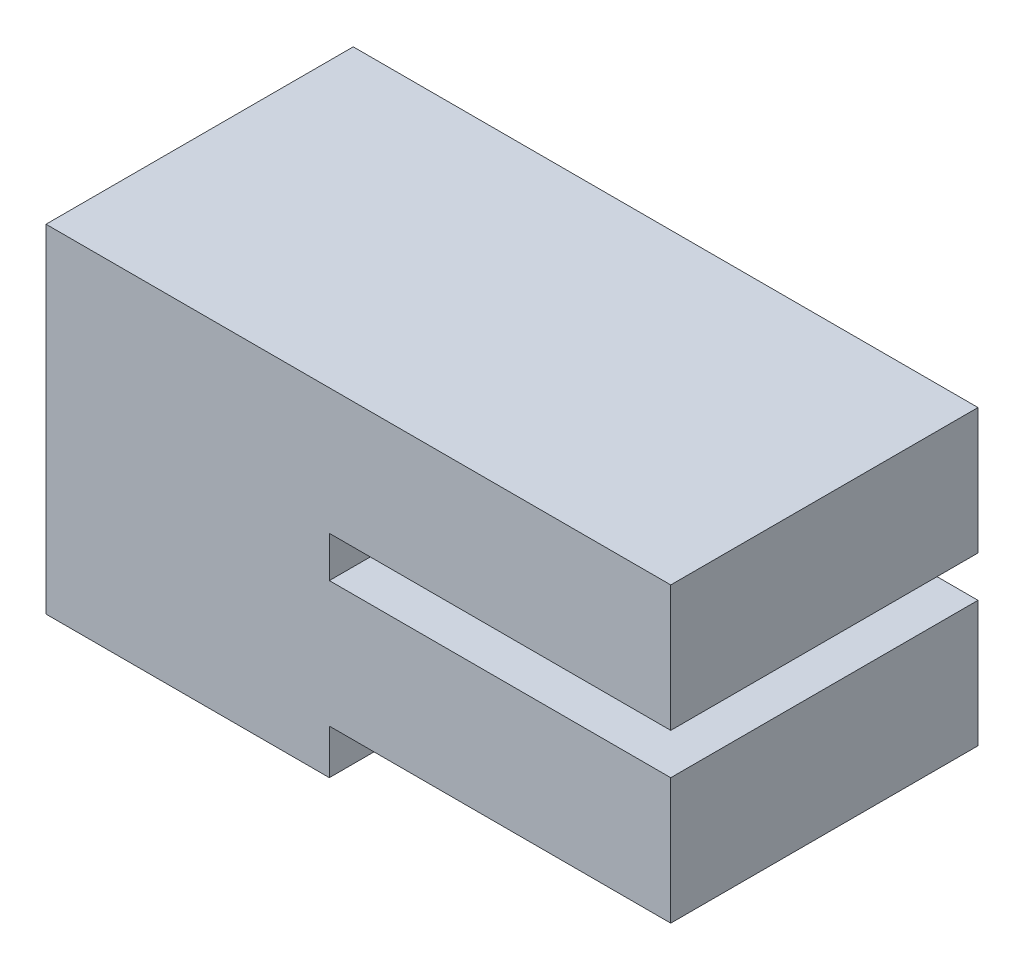
ISO-10303-21;
HEADER;
FILE_DESCRIPTION(('STEP AP214'),'2;1');
FILE_NAME('part.step','',(''),(''),'','','');
FILE_SCHEMA(('AUTOMOTIVE_DESIGN { 1 0 10303 214 1 1 1 1 }'));
ENDSEC;
DATA;
#1=APPLICATION_CONTEXT('core data for automotive mechanical design processes');
#2=APPLICATION_PROTOCOL_DEFINITION('international standard','automotive_design',2000,#1);
#3=PRODUCT_CONTEXT('',#1,'mechanical');
#4=PRODUCT('Part','Part','',(#3));
#5=PRODUCT_RELATED_PRODUCT_CATEGORY('part','',(#4));
#6=PRODUCT_DEFINITION_FORMATION('','',#4);
#7=PRODUCT_DEFINITION_CONTEXT('part definition',#1,'design');
#8=PRODUCT_DEFINITION('design','',#6,#7);
#9=PRODUCT_DEFINITION_SHAPE('','',#8);
#10=(LENGTH_UNIT() NAMED_UNIT(*) SI_UNIT(.MILLI.,.METRE.));
#11=(NAMED_UNIT(*) PLANE_ANGLE_UNIT() SI_UNIT($,.RADIAN.));
#12=(NAMED_UNIT(*) SI_UNIT($,.STERADIAN.) SOLID_ANGLE_UNIT());
#13=UNCERTAINTY_MEASURE_WITH_UNIT(LENGTH_MEASURE(1.E-05),#10,'distance_accuracy_value','');
#14=(GEOMETRIC_REPRESENTATION_CONTEXT(3) GLOBAL_UNCERTAINTY_ASSIGNED_CONTEXT((#13)) GLOBAL_UNIT_ASSIGNED_CONTEXT((#10,
#11,#12)) REPRESENTATION_CONTEXT('',''));
#15=CARTESIAN_POINT('',(0.,0.,0.));
#16=DIRECTION('',(0.,0.,1.));
#17=DIRECTION('',(1.,0.,0.));
#18=AXIS2_PLACEMENT_3D('',#15,#16,#17);
#19=CARTESIAN_POINT('',(8.3,0.,9.));
#20=DIRECTION('',(-1.,0.,0.));
#21=DIRECTION('',(0.,0.,1.));
#22=AXIS2_PLACEMENT_3D('',#19,#20,#21);
#23=PLANE('',#22);
#24=DIRECTION('',(0.,1.,0.));
#25=VECTOR('',#24,1.);
#26=CARTESIAN_POINT('',(8.3,0.,9.));
#27=LINE('',#26,#25);
#28=CARTESIAN_POINT('',(8.3,5.,9.));
#29=VERTEX_POINT('',#28);
#30=CARTESIAN_POINT('',(8.3,6.2,9.));
#31=VERTEX_POINT('',#30);
#32=EDGE_CURVE('E48',#29,#31,#27,.T.);
#33=ORIENTED_EDGE('',*,*,#32,.F.);
#34=DIRECTION('',(0.,0.,1.));
#35=VECTOR('',#34,1.);
#36=CARTESIAN_POINT('',(8.3,5.,0.));
#37=LINE('',#36,#35);
#38=CARTESIAN_POINT('',(8.3,5.,0.));
#39=VERTEX_POINT('',#38);
#40=EDGE_CURVE('E144',#39,#29,#37,.T.);
#41=ORIENTED_EDGE('',*,*,#40,.F.);
#42=DIRECTION('',(0.,1.,0.));
#43=VECTOR('',#42,1.);
#44=CARTESIAN_POINT('',(8.3,0.,0.));
#45=LINE('',#44,#43);
#46=CARTESIAN_POINT('',(8.3,6.2,0.));
#47=VERTEX_POINT('',#46);
#48=EDGE_CURVE('E183',#39,#47,#45,.T.);
#49=ORIENTED_EDGE('',*,*,#48,.T.);
#50=DIRECTION('',(0.,0.,1.));
#51=VECTOR('',#50,1.);
#52=CARTESIAN_POINT('',(8.3,6.2,0.));
#53=LINE('',#52,#51);
#54=EDGE_CURVE('E156',#47,#31,#53,.T.);
#55=ORIENTED_EDGE('',*,*,#54,.T.);
#56=EDGE_LOOP('',(#33,#41,#49,#55));
#57=FACE_BOUND('',#56,.T.);
#58=ADVANCED_FACE('F33',(#57),#23,.F.);
#59=CARTESIAN_POINT('',(0.,0.,9.));
#60=DIRECTION('',(1.,0.,0.));
#61=DIRECTION('',(0.,0.,-1.));
#62=AXIS2_PLACEMENT_3D('',#59,#60,#61);
#63=PLANE('',#62);
#64=DIRECTION('',(0.,-1.,0.));
#65=VECTOR('',#64,1.);
#66=CARTESIAN_POINT('',(0.,0.,0.));
#67=LINE('',#66,#65);
#68=CARTESIAN_POINT('',(0.,9.8906033,0.));
#69=VERTEX_POINT('',#68);
#70=CARTESIAN_POINT('',(0.,0.,0.));
#71=VERTEX_POINT('',#70);
#72=EDGE_CURVE('E164',#69,#71,#67,.T.);
#73=ORIENTED_EDGE('',*,*,#72,.T.);
#74=DIRECTION('',(0.,0.,-1.));
#75=VECTOR('',#74,1.);
#76=CARTESIAN_POINT('',(0.,0.,9.));
#77=LINE('',#76,#75);
#78=CARTESIAN_POINT('',(0.,0.,9.));
#79=VERTEX_POINT('',#78);
#80=EDGE_CURVE('E11',#79,#71,#77,.T.);
#81=ORIENTED_EDGE('',*,*,#80,.F.);
#82=DIRECTION('',(0.,-1.,0.));
#83=VECTOR('',#82,1.);
#84=CARTESIAN_POINT('',(0.,0.,9.));
#85=LINE('',#84,#83);
#86=CARTESIAN_POINT('',(0.,9.8906033,9.));
#87=VERTEX_POINT('',#86);
#88=EDGE_CURVE('E168',#87,#79,#85,.T.);
#89=ORIENTED_EDGE('',*,*,#88,.F.);
#90=DIRECTION('',(0.,0.,-1.));
#91=VECTOR('',#90,1.);
#92=CARTESIAN_POINT('',(0.,9.8906033,9.));
#93=LINE('',#92,#91);
#94=EDGE_CURVE('E178',#87,#69,#93,.T.);
#95=ORIENTED_EDGE('',*,*,#94,.T.);
#96=EDGE_LOOP('',(#73,#81,#89,#95));
#97=FACE_BOUND('',#96,.T.);
#98=ADVANCED_FACE('F35',(#97),#63,.F.);
#99=CARTESIAN_POINT('',(0.,0.,9.));
#100=DIRECTION('',(0.,1.,0.));
#101=DIRECTION('',(0.,0.,1.));
#102=AXIS2_PLACEMENT_3D('',#99,#100,#101);
#103=PLANE('',#102);
#104=DIRECTION('',(1.,0.,0.));
#105=VECTOR('',#104,1.);
#106=CARTESIAN_POINT('',(0.,0.,0.));
#107=LINE('',#106,#105);
#108=CARTESIAN_POINT('',(8.3,0.,0.));
#109=VERTEX_POINT('',#108);
#110=EDGE_CURVE('E181',#71,#109,#107,.T.);
#111=ORIENTED_EDGE('',*,*,#110,.T.);
#112=DIRECTION('',(0.,0.,-1.));
#113=VECTOR('',#112,1.);
#114=CARTESIAN_POINT('',(8.3,0.,9.));
#115=LINE('',#114,#113);
#116=CARTESIAN_POINT('',(8.3,0.,9.));
#117=VERTEX_POINT('',#116);
#118=EDGE_CURVE('E41',#117,#109,#115,.T.);
#119=ORIENTED_EDGE('',*,*,#118,.F.);
#120=DIRECTION('',(1.,0.,0.));
#121=VECTOR('',#120,1.);
#122=CARTESIAN_POINT('',(0.,0.,9.));
#123=LINE('',#122,#121);
#124=EDGE_CURVE('E171',#79,#117,#123,.T.);
#125=ORIENTED_EDGE('',*,*,#124,.F.);
#126=ORIENTED_EDGE('',*,*,#80,.T.);
#127=EDGE_LOOP('',(#111,#119,#125,#126));
#128=FACE_BOUND('',#127,.T.);
#129=ADVANCED_FACE('F193',(#128),#103,.F.);
#130=CARTESIAN_POINT('',(8.3,1.3093967,0.));
#131=VERTEX_POINT('',#130);
#132=EDGE_CURVE('E184',#109,#131,#45,.T.);
#133=ORIENTED_EDGE('',*,*,#132,.T.);
#134=DIRECTION('',(0.,0.,1.));
#135=VECTOR('',#134,1.);
#136=CARTESIAN_POINT('',(8.3,1.3093967,0.));
#137=LINE('',#136,#135);
#138=CARTESIAN_POINT('',(8.3,1.3093967,9.));
#139=VERTEX_POINT('',#138);
#140=EDGE_CURVE('E56',#131,#139,#137,.T.);
#141=ORIENTED_EDGE('',*,*,#140,.T.);
#142=EDGE_CURVE('E174',#117,#139,#27,.T.);
#143=ORIENTED_EDGE('',*,*,#142,.F.);
#144=ORIENTED_EDGE('',*,*,#118,.T.);
#145=EDGE_LOOP('',(#133,#141,#143,#144));
#146=FACE_BOUND('',#145,.T.);
#147=ADVANCED_FACE('F190',(#146),#23,.F.);
#148=CARTESIAN_POINT('',(0.,9.8906033,9.));
#149=DIRECTION('',(0.,-1.,0.));
#150=DIRECTION('',(0.,0.,-1.));
#151=AXIS2_PLACEMENT_3D('',#148,#149,#150);
#152=PLANE('',#151);
#153=DIRECTION('',(-1.,0.,0.));
#154=VECTOR('',#153,1.);
#155=CARTESIAN_POINT('',(0.,9.8906033,0.));
#156=LINE('',#155,#154);
#157=CARTESIAN_POINT('',(18.3,9.8906033,0.));
#158=VERTEX_POINT('',#157);
#159=EDGE_CURVE('E172',#158,#69,#156,.T.);
#160=ORIENTED_EDGE('',*,*,#159,.T.);
#161=ORIENTED_EDGE('',*,*,#94,.F.);
#162=DIRECTION('',(-1.,0.,0.));
#163=VECTOR('',#162,1.);
#164=CARTESIAN_POINT('',(0.,9.8906033,9.));
#165=LINE('',#164,#163);
#166=CARTESIAN_POINT('',(18.3,9.8906033,9.));
#167=VERTEX_POINT('',#166);
#168=EDGE_CURVE('E176',#167,#87,#165,.T.);
#169=ORIENTED_EDGE('',*,*,#168,.F.);
#170=DIRECTION('',(0.,0.,1.));
#171=VECTOR('',#170,1.);
#172=CARTESIAN_POINT('',(18.3,9.8906033,0.));
#173=LINE('',#172,#171);
#174=EDGE_CURVE('E161',#158,#167,#173,.T.);
#175=ORIENTED_EDGE('',*,*,#174,.F.);
#176=EDGE_LOOP('',(#160,#161,#169,#175));
#177=FACE_BOUND('',#176,.T.);
#178=ADVANCED_FACE('F198',(#177),#152,.F.);
#179=CARTESIAN_POINT('',(0.,0.,9.));
#180=DIRECTION('',(0.,0.,-1.));
#181=DIRECTION('',(-1.,0.,0.));
#182=AXIS2_PLACEMENT_3D('',#179,#180,#181);
#183=PLANE('',#182);
#184=ORIENTED_EDGE('',*,*,#88,.T.);
#185=ORIENTED_EDGE('',*,*,#124,.T.);
#186=ORIENTED_EDGE('',*,*,#142,.T.);
#187=DIRECTION('',(1.,0.,0.));
#188=VECTOR('',#187,1.);
#189=CARTESIAN_POINT('',(8.3,1.3093967,9.));
#190=LINE('',#189,#188);
#191=CARTESIAN_POINT('',(18.3,1.3093967,9.));
#192=VERTEX_POINT('',#191);
#193=EDGE_CURVE('E141',#139,#192,#190,.T.);
#194=ORIENTED_EDGE('',*,*,#193,.T.);
#195=DIRECTION('',(0.,1.,0.));
#196=VECTOR('',#195,1.);
#197=CARTESIAN_POINT('',(18.3,5.,9.));
#198=LINE('',#197,#196);
#199=CARTESIAN_POINT('',(18.3,5.,9.));
#200=VERTEX_POINT('',#199);
#201=EDGE_CURVE('E118',#192,#200,#198,.T.);
#202=ORIENTED_EDGE('',*,*,#201,.T.);
#203=DIRECTION('',(-1.,0.,0.));
#204=VECTOR('',#203,1.);
#205=CARTESIAN_POINT('',(8.3,5.,9.));
#206=LINE('',#205,#204);
#207=EDGE_CURVE('E135',#200,#29,#206,.T.);
#208=ORIENTED_EDGE('',*,*,#207,.T.);
#209=ORIENTED_EDGE('',*,*,#32,.T.);
#210=DIRECTION('',(1.,0.,0.));
#211=VECTOR('',#210,1.);
#212=CARTESIAN_POINT('',(8.3,6.2,9.));
#213=LINE('',#212,#211);
#214=CARTESIAN_POINT('',(18.3,6.2,9.));
#215=VERTEX_POINT('',#214);
#216=EDGE_CURVE('E146',#31,#215,#213,.T.);
#217=ORIENTED_EDGE('',*,*,#216,.T.);
#218=DIRECTION('',(0.,1.,0.));
#219=VECTOR('',#218,1.);
#220=CARTESIAN_POINT('',(18.3,9.8906033,9.));
#221=LINE('',#220,#219);
#222=EDGE_CURVE('E153',#215,#167,#221,.T.);
#223=ORIENTED_EDGE('',*,*,#222,.T.);
#224=ORIENTED_EDGE('',*,*,#168,.T.);
#225=EDGE_LOOP('',(#184,#185,#186,#194,#202,#208,#209,#217,#223,#224));
#226=FACE_BOUND('',#225,.T.);
#227=ADVANCED_FACE('F212',(#226),#183,.F.);
#228=CARTESIAN_POINT('',(0.,0.,0.));
#229=DIRECTION('',(0.,0.,-1.));
#230=DIRECTION('',(-1.,0.,0.));
#231=AXIS2_PLACEMENT_3D('',#228,#229,#230);
#232=PLANE('',#231);
#233=ORIENTED_EDGE('',*,*,#72,.F.);
#234=ORIENTED_EDGE('',*,*,#159,.F.);
#235=DIRECTION('',(0.,1.,0.));
#236=VECTOR('',#235,1.);
#237=CARTESIAN_POINT('',(18.3,9.8906033,0.));
#238=LINE('',#237,#236);
#239=CARTESIAN_POINT('',(18.3,6.2,0.));
#240=VERTEX_POINT('',#239);
#241=EDGE_CURVE('E152',#240,#158,#238,.T.);
#242=ORIENTED_EDGE('',*,*,#241,.F.);
#243=DIRECTION('',(1.,0.,0.));
#244=VECTOR('',#243,1.);
#245=CARTESIAN_POINT('',(8.3,6.2,0.));
#246=LINE('',#245,#244);
#247=EDGE_CURVE('E149',#47,#240,#246,.T.);
#248=ORIENTED_EDGE('',*,*,#247,.F.);
#249=ORIENTED_EDGE('',*,*,#48,.F.);
#250=DIRECTION('',(-1.,0.,0.));
#251=VECTOR('',#250,1.);
#252=CARTESIAN_POINT('',(8.3,5.,0.));
#253=LINE('',#252,#251);
#254=CARTESIAN_POINT('',(18.3,5.,0.));
#255=VERTEX_POINT('',#254);
#256=EDGE_CURVE('E132',#255,#39,#253,.T.);
#257=ORIENTED_EDGE('',*,*,#256,.F.);
#258=DIRECTION('',(0.,1.,0.));
#259=VECTOR('',#258,1.);
#260=CARTESIAN_POINT('',(18.3,5.,0.));
#261=LINE('',#260,#259);
#262=CARTESIAN_POINT('',(18.3,1.3093967,0.));
#263=VERTEX_POINT('',#262);
#264=EDGE_CURVE('E115',#263,#255,#261,.T.);
#265=ORIENTED_EDGE('',*,*,#264,.F.);
#266=DIRECTION('',(1.,0.,0.));
#267=VECTOR('',#266,1.);
#268=CARTESIAN_POINT('',(8.3,1.3093967,0.));
#269=LINE('',#268,#267);
#270=EDGE_CURVE('E130',#131,#263,#269,.T.);
#271=ORIENTED_EDGE('',*,*,#270,.F.);
#272=ORIENTED_EDGE('',*,*,#132,.F.);
#273=ORIENTED_EDGE('',*,*,#110,.F.);
#274=EDGE_LOOP('',(#233,#234,#242,#248,#249,#257,#265,#271,#272,#273));
#275=FACE_BOUND('',#274,.T.);
#276=ADVANCED_FACE('F128',(#275),#232,.T.);
#277=CARTESIAN_POINT('',(18.3,9.8906033,0.));
#278=DIRECTION('',(1.,0.,0.));
#279=DIRECTION('',(0.,0.,-1.));
#280=AXIS2_PLACEMENT_3D('',#277,#278,#279);
#281=PLANE('',#280);
#282=ORIENTED_EDGE('',*,*,#222,.F.);
#283=DIRECTION('',(0.,0.,1.));
#284=VECTOR('',#283,1.);
#285=CARTESIAN_POINT('',(18.3,6.2,0.));
#286=LINE('',#285,#284);
#287=EDGE_CURVE('E165',#240,#215,#286,.T.);
#288=ORIENTED_EDGE('',*,*,#287,.F.);
#289=ORIENTED_EDGE('',*,*,#241,.T.);
#290=ORIENTED_EDGE('',*,*,#174,.T.);
#291=EDGE_LOOP('',(#282,#288,#289,#290));
#292=FACE_BOUND('',#291,.T.);
#293=ADVANCED_FACE('F213',(#292),#281,.T.);
#294=CARTESIAN_POINT('',(8.3,6.2,0.));
#295=DIRECTION('',(0.,-1.,0.));
#296=DIRECTION('',(0.,0.,-1.));
#297=AXIS2_PLACEMENT_3D('',#294,#295,#296);
#298=PLANE('',#297);
#299=ORIENTED_EDGE('',*,*,#216,.F.);
#300=ORIENTED_EDGE('',*,*,#54,.F.);
#301=ORIENTED_EDGE('',*,*,#247,.T.);
#302=ORIENTED_EDGE('',*,*,#287,.T.);
#303=EDGE_LOOP('',(#299,#300,#301,#302));
#304=FACE_BOUND('',#303,.T.);
#305=ADVANCED_FACE('F206',(#304),#298,.T.);
#306=CARTESIAN_POINT('',(8.3,5.,0.));
#307=DIRECTION('',(0.,1.,0.));
#308=DIRECTION('',(0.,0.,1.));
#309=AXIS2_PLACEMENT_3D('',#306,#307,#308);
#310=PLANE('',#309);
#311=ORIENTED_EDGE('',*,*,#207,.F.);
#312=DIRECTION('',(0.,0.,1.));
#313=VECTOR('',#312,1.);
#314=CARTESIAN_POINT('',(18.3,5.,0.));
#315=LINE('',#314,#313);
#316=EDGE_CURVE('E123',#255,#200,#315,.T.);
#317=ORIENTED_EDGE('',*,*,#316,.F.);
#318=ORIENTED_EDGE('',*,*,#256,.T.);
#319=ORIENTED_EDGE('',*,*,#40,.T.);
#320=EDGE_LOOP('',(#311,#317,#318,#319));
#321=FACE_BOUND('',#320,.T.);
#322=ADVANCED_FACE('F210',(#321),#310,.T.);
#323=CARTESIAN_POINT('',(18.3,5.,0.));
#324=DIRECTION('',(1.,0.,0.));
#325=DIRECTION('',(0.,0.,-1.));
#326=AXIS2_PLACEMENT_3D('',#323,#324,#325);
#327=PLANE('',#326);
#328=ORIENTED_EDGE('',*,*,#201,.F.);
#329=DIRECTION('',(0.,0.,1.));
#330=VECTOR('',#329,1.);
#331=CARTESIAN_POINT('',(18.3,1.3093967,0.));
#332=LINE('',#331,#330);
#333=EDGE_CURVE('E112',#263,#192,#332,.T.);
#334=ORIENTED_EDGE('',*,*,#333,.F.);
#335=ORIENTED_EDGE('',*,*,#264,.T.);
#336=ORIENTED_EDGE('',*,*,#316,.T.);
#337=EDGE_LOOP('',(#328,#334,#335,#336));
#338=FACE_BOUND('',#337,.T.);
#339=ADVANCED_FACE('F114',(#338),#327,.T.);
#340=CARTESIAN_POINT('',(8.3,1.3093967,0.));
#341=DIRECTION('',(0.,-1.,0.));
#342=DIRECTION('',(0.,0.,-1.));
#343=AXIS2_PLACEMENT_3D('',#340,#341,#342);
#344=PLANE('',#343);
#345=ORIENTED_EDGE('',*,*,#193,.F.);
#346=ORIENTED_EDGE('',*,*,#140,.F.);
#347=ORIENTED_EDGE('',*,*,#270,.T.);
#348=ORIENTED_EDGE('',*,*,#333,.T.);
#349=EDGE_LOOP('',(#345,#346,#347,#348));
#350=FACE_BOUND('',#349,.T.);
#351=ADVANCED_FACE('F134',(#350),#344,.T.);
#352=CLOSED_SHELL('',(#58,#98,#129,#147,#178,#227,#276,#293,#305,#322,#339,#351));
#353=MANIFOLD_SOLID_BREP('B2',#352);
#354=ADVANCED_BREP_SHAPE_REPRESENTATION('',(#18,#353),#14);
#355=SHAPE_DEFINITION_REPRESENTATION(#9,#354);
ENDSEC;
END-ISO-10303-21;
